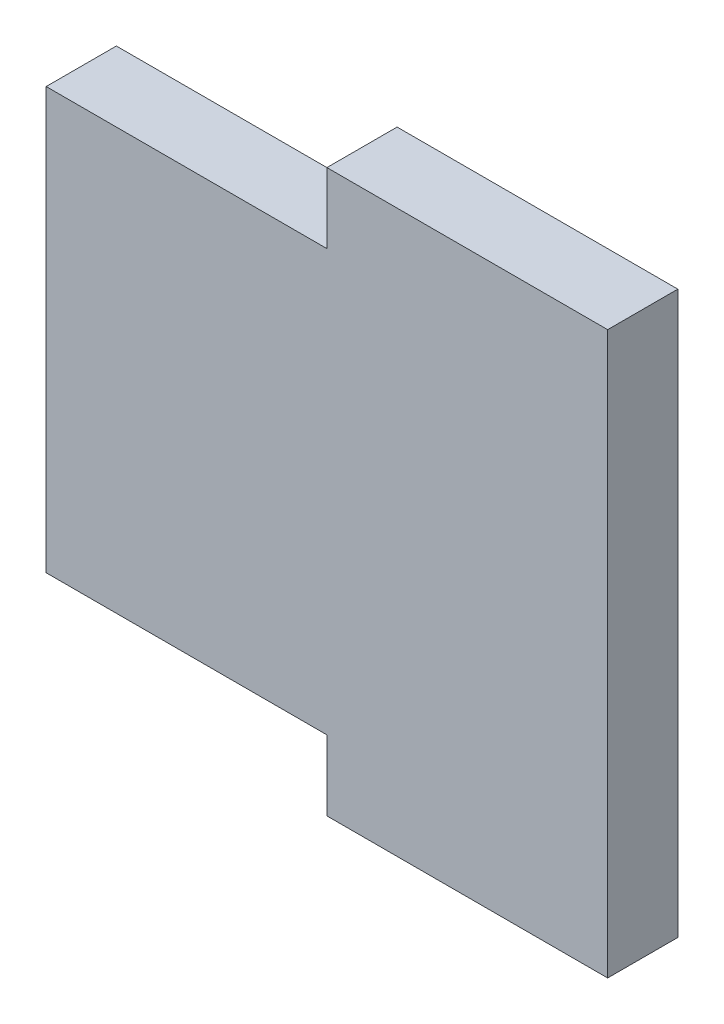
ISO-10303-21;
HEADER;
FILE_DESCRIPTION(('STEP AP214'),'2;1');
FILE_NAME('part.step','',(''),(''),'','','');
FILE_SCHEMA(('AUTOMOTIVE_DESIGN { 1 0 10303 214 1 1 1 1 }'));
ENDSEC;
DATA;
#1=APPLICATION_CONTEXT('core data for automotive mechanical design processes');
#2=APPLICATION_PROTOCOL_DEFINITION('international standard','automotive_design',2000,#1);
#3=PRODUCT_CONTEXT('',#1,'mechanical');
#4=PRODUCT('Part','Part','',(#3));
#5=PRODUCT_RELATED_PRODUCT_CATEGORY('part','',(#4));
#6=PRODUCT_DEFINITION_FORMATION('','',#4);
#7=PRODUCT_DEFINITION_CONTEXT('part definition',#1,'design');
#8=PRODUCT_DEFINITION('design','',#6,#7);
#9=PRODUCT_DEFINITION_SHAPE('','',#8);
#10=(LENGTH_UNIT() NAMED_UNIT(*) SI_UNIT(.MILLI.,.METRE.));
#11=(NAMED_UNIT(*) PLANE_ANGLE_UNIT() SI_UNIT($,.RADIAN.));
#12=(NAMED_UNIT(*) SI_UNIT($,.STERADIAN.) SOLID_ANGLE_UNIT());
#13=UNCERTAINTY_MEASURE_WITH_UNIT(LENGTH_MEASURE(1.E-05),#10,'distance_accuracy_value','');
#14=(GEOMETRIC_REPRESENTATION_CONTEXT(3) GLOBAL_UNCERTAINTY_ASSIGNED_CONTEXT((#13)) GLOBAL_UNIT_ASSIGNED_CONTEXT((#10,
#11,#12)) REPRESENTATION_CONTEXT('',''));
#15=CARTESIAN_POINT('',(0.,0.,0.));
#16=DIRECTION('',(0.,0.,1.));
#17=DIRECTION('',(1.,0.,0.));
#18=AXIS2_PLACEMENT_3D('',#15,#16,#17);
#19=CARTESIAN_POINT('',(250.600505145563,0.,3.175));
#20=DIRECTION('',(0.,-1.,0.));
#21=DIRECTION('',(0.,0.,-1.));
#22=AXIS2_PLACEMENT_3D('',#19,#20,#21);
#23=PLANE('',#22);
#24=DIRECTION('',(-1.,0.,0.));
#25=VECTOR('',#24,1.);
#26=CARTESIAN_POINT('',(250.600505145563,0.,0.));
#27=LINE('',#26,#25);
#28=CARTESIAN_POINT('',(250.600505145563,0.,0.));
#29=VERTEX_POINT('',#28);
#30=CARTESIAN_POINT('',(237.900505145563,0.,0.));
#31=VERTEX_POINT('',#30);
#32=EDGE_CURVE('E129',#29,#31,#27,.T.);
#33=ORIENTED_EDGE('',*,*,#32,.T.);
#34=DIRECTION('',(0.,0.,-1.));
#35=VECTOR('',#34,1.);
#36=CARTESIAN_POINT('',(237.900505145563,0.,3.175));
#37=LINE('',#36,#35);
#38=CARTESIAN_POINT('',(237.900505145563,0.,3.175));
#39=VERTEX_POINT('',#38);
#40=EDGE_CURVE('E11',#39,#31,#37,.T.);
#41=ORIENTED_EDGE('',*,*,#40,.F.);
#42=DIRECTION('',(-1.,0.,0.));
#43=VECTOR('',#42,1.);
#44=CARTESIAN_POINT('',(250.600505145563,0.,3.175));
#45=LINE('',#44,#43);
#46=CARTESIAN_POINT('',(250.600505145563,0.,3.175));
#47=VERTEX_POINT('',#46);
#48=EDGE_CURVE('E148',#47,#39,#45,.T.);
#49=ORIENTED_EDGE('',*,*,#48,.F.);
#50=DIRECTION('',(0.,0.,-1.));
#51=VECTOR('',#50,1.);
#52=CARTESIAN_POINT('',(250.600505145563,0.,3.175));
#53=LINE('',#52,#51);
#54=EDGE_CURVE('E49',#47,#29,#53,.T.);
#55=ORIENTED_EDGE('',*,*,#54,.T.);
#56=EDGE_LOOP('',(#33,#41,#49,#55));
#57=FACE_BOUND('',#56,.T.);
#58=ADVANCED_FACE('F33',(#57),#23,.F.);
#59=CARTESIAN_POINT('',(237.900505145563,0.,3.175));
#60=DIRECTION('',(1.,0.,0.));
#61=DIRECTION('',(0.,0.,-1.));
#62=AXIS2_PLACEMENT_3D('',#59,#60,#61);
#63=PLANE('',#62);
#64=DIRECTION('',(0.,-1.,0.));
#65=VECTOR('',#64,1.);
#66=CARTESIAN_POINT('',(237.900505145563,0.,0.));
#67=LINE('',#66,#65);
#68=CARTESIAN_POINT('',(237.900505145563,-3.175,0.));
#69=VERTEX_POINT('',#68);
#70=EDGE_CURVE('E131',#31,#69,#67,.T.);
#71=ORIENTED_EDGE('',*,*,#70,.T.);
#72=DIRECTION('',(0.,0.,-1.));
#73=VECTOR('',#72,1.);
#74=CARTESIAN_POINT('',(237.900505145563,-3.175,3.175));
#75=LINE('',#74,#73);
#76=CARTESIAN_POINT('',(237.900505145563,-3.175,3.175));
#77=VERTEX_POINT('',#76);
#78=EDGE_CURVE('E41',#77,#69,#75,.T.);
#79=ORIENTED_EDGE('',*,*,#78,.F.);
#80=DIRECTION('',(0.,-1.,0.));
#81=VECTOR('',#80,1.);
#82=CARTESIAN_POINT('',(237.900505145563,0.,3.175));
#83=LINE('',#82,#81);
#84=EDGE_CURVE('E87',#39,#77,#83,.T.);
#85=ORIENTED_EDGE('',*,*,#84,.F.);
#86=ORIENTED_EDGE('',*,*,#40,.T.);
#87=EDGE_LOOP('',(#71,#79,#85,#86));
#88=FACE_BOUND('',#87,.T.);
#89=ADVANCED_FACE('F162',(#88),#63,.F.);
#90=CARTESIAN_POINT('',(225.200505145563,-3.175,3.175));
#91=DIRECTION('',(0.,1.,0.));
#92=DIRECTION('',(0.,0.,1.));
#93=AXIS2_PLACEMENT_3D('',#90,#91,#92);
#94=PLANE('',#93);
#95=DIRECTION('',(1.,0.,0.));
#96=VECTOR('',#95,1.);
#97=CARTESIAN_POINT('',(225.200505145563,-3.175,0.));
#98=LINE('',#97,#96);
#99=CARTESIAN_POINT('',(225.200505145563,-3.175,0.));
#100=VERTEX_POINT('',#99);
#101=EDGE_CURVE('E134',#100,#69,#98,.T.);
#102=ORIENTED_EDGE('',*,*,#101,.F.);
#103=DIRECTION('',(0.,0.,-1.));
#104=VECTOR('',#103,1.);
#105=CARTESIAN_POINT('',(225.200505145563,-3.175,3.175));
#106=LINE('',#105,#104);
#107=CARTESIAN_POINT('',(225.200505145563,-3.175,3.175));
#108=VERTEX_POINT('',#107);
#109=EDGE_CURVE('E155',#108,#100,#106,.T.);
#110=ORIENTED_EDGE('',*,*,#109,.F.);
#111=DIRECTION('',(1.,0.,0.));
#112=VECTOR('',#111,1.);
#113=CARTESIAN_POINT('',(225.200505145563,-3.175,3.175));
#114=LINE('',#113,#112);
#115=EDGE_CURVE('E161',#108,#77,#114,.T.);
#116=ORIENTED_EDGE('',*,*,#115,.T.);
#117=ORIENTED_EDGE('',*,*,#78,.T.);
#118=EDGE_LOOP('',(#102,#110,#116,#117));
#119=FACE_BOUND('',#118,.T.);
#120=ADVANCED_FACE('F159',(#119),#94,.T.);
#121=CARTESIAN_POINT('',(225.200505145563,-3.175,3.175));
#122=DIRECTION('',(1.,0.,0.));
#123=DIRECTION('',(0.,0.,-1.));
#124=AXIS2_PLACEMENT_3D('',#121,#122,#123);
#125=PLANE('',#124);
#126=DIRECTION('',(0.,-1.,0.));
#127=VECTOR('',#126,1.);
#128=CARTESIAN_POINT('',(225.200505145563,-3.175,0.));
#129=LINE('',#128,#127);
#130=CARTESIAN_POINT('',(225.200505145563,-22.225,0.));
#131=VERTEX_POINT('',#130);
#132=EDGE_CURVE('E137',#100,#131,#129,.T.);
#133=ORIENTED_EDGE('',*,*,#132,.T.);
#134=DIRECTION('',(0.,0.,-1.));
#135=VECTOR('',#134,1.);
#136=CARTESIAN_POINT('',(225.200505145563,-22.225,3.175));
#137=LINE('',#136,#135);
#138=CARTESIAN_POINT('',(225.200505145563,-22.225,3.175));
#139=VERTEX_POINT('',#138);
#140=EDGE_CURVE('E152',#139,#131,#137,.T.);
#141=ORIENTED_EDGE('',*,*,#140,.F.);
#142=DIRECTION('',(0.,-1.,0.));
#143=VECTOR('',#142,1.);
#144=CARTESIAN_POINT('',(225.200505145563,-3.175,3.175));
#145=LINE('',#144,#143);
#146=EDGE_CURVE('E174',#108,#139,#145,.T.);
#147=ORIENTED_EDGE('',*,*,#146,.F.);
#148=ORIENTED_EDGE('',*,*,#109,.T.);
#149=EDGE_LOOP('',(#133,#141,#147,#148));
#150=FACE_BOUND('',#149,.T.);
#151=ADVANCED_FACE('F170',(#150),#125,.F.);
#152=CARTESIAN_POINT('',(225.200505145563,-22.225,3.175));
#153=DIRECTION('',(0.,1.,0.));
#154=DIRECTION('',(0.,0.,1.));
#155=AXIS2_PLACEMENT_3D('',#152,#153,#154);
#156=PLANE('',#155);
#157=DIRECTION('',(1.,0.,0.));
#158=VECTOR('',#157,1.);
#159=CARTESIAN_POINT('',(225.200505145563,-22.225,0.));
#160=LINE('',#159,#158);
#161=CARTESIAN_POINT('',(237.900505145563,-22.225,0.));
#162=VERTEX_POINT('',#161);
#163=EDGE_CURVE('E139',#131,#162,#160,.T.);
#164=ORIENTED_EDGE('',*,*,#163,.T.);
#165=DIRECTION('',(0.,0.,-1.));
#166=VECTOR('',#165,1.);
#167=CARTESIAN_POINT('',(237.900505145563,-22.225,3.175));
#168=LINE('',#167,#166);
#169=CARTESIAN_POINT('',(237.900505145563,-22.225,3.175));
#170=VERTEX_POINT('',#169);
#171=EDGE_CURVE('E112',#170,#162,#168,.T.);
#172=ORIENTED_EDGE('',*,*,#171,.F.);
#173=DIRECTION('',(1.,0.,0.));
#174=VECTOR('',#173,1.);
#175=CARTESIAN_POINT('',(225.200505145563,-22.225,3.175));
#176=LINE('',#175,#174);
#177=EDGE_CURVE('E120',#139,#170,#176,.T.);
#178=ORIENTED_EDGE('',*,*,#177,.F.);
#179=ORIENTED_EDGE('',*,*,#140,.T.);
#180=EDGE_LOOP('',(#164,#172,#178,#179));
#181=FACE_BOUND('',#180,.T.);
#182=ADVANCED_FACE('F173',(#181),#156,.F.);
#183=CARTESIAN_POINT('',(237.900505145563,-25.4,3.175));
#184=DIRECTION('',(-1.,0.,0.));
#185=DIRECTION('',(0.,0.,1.));
#186=AXIS2_PLACEMENT_3D('',#183,#184,#185);
#187=PLANE('',#186);
#188=DIRECTION('',(0.,1.,0.));
#189=VECTOR('',#188,1.);
#190=CARTESIAN_POINT('',(237.900505145563,-25.4,0.));
#191=LINE('',#190,#189);
#192=CARTESIAN_POINT('',(237.900505145563,-25.4,0.));
#193=VERTEX_POINT('',#192);
#194=EDGE_CURVE('E108',#193,#162,#191,.T.);
#195=ORIENTED_EDGE('',*,*,#194,.F.);
#196=DIRECTION('',(0.,0.,-1.));
#197=VECTOR('',#196,1.);
#198=CARTESIAN_POINT('',(237.900505145563,-25.4,3.175));
#199=LINE('',#198,#197);
#200=CARTESIAN_POINT('',(237.900505145563,-25.4,3.175));
#201=VERTEX_POINT('',#200);
#202=EDGE_CURVE('E103',#201,#193,#199,.T.);
#203=ORIENTED_EDGE('',*,*,#202,.F.);
#204=DIRECTION('',(0.,1.,0.));
#205=VECTOR('',#204,1.);
#206=CARTESIAN_POINT('',(237.900505145563,-25.4,3.175));
#207=LINE('',#206,#205);
#208=EDGE_CURVE('E106',#201,#170,#207,.T.);
#209=ORIENTED_EDGE('',*,*,#208,.T.);
#210=ORIENTED_EDGE('',*,*,#171,.T.);
#211=EDGE_LOOP('',(#195,#203,#209,#210));
#212=FACE_BOUND('',#211,.T.);
#213=ADVANCED_FACE('F105',(#212),#187,.T.);
#214=CARTESIAN_POINT('',(250.600505145563,-25.4,3.175));
#215=DIRECTION('',(0.,-1.,0.));
#216=DIRECTION('',(0.,0.,-1.));
#217=AXIS2_PLACEMENT_3D('',#214,#215,#216);
#218=PLANE('',#217);
#219=DIRECTION('',(-1.,0.,0.));
#220=VECTOR('',#219,1.);
#221=CARTESIAN_POINT('',(250.600505145563,-25.4,0.));
#222=LINE('',#221,#220);
#223=CARTESIAN_POINT('',(250.600505145563,-25.4,0.));
#224=VERTEX_POINT('',#223);
#225=EDGE_CURVE('E143',#224,#193,#222,.T.);
#226=ORIENTED_EDGE('',*,*,#225,.F.);
#227=DIRECTION('',(0.,0.,-1.));
#228=VECTOR('',#227,1.);
#229=CARTESIAN_POINT('',(250.600505145563,-25.4,3.175));
#230=LINE('',#229,#228);
#231=CARTESIAN_POINT('',(250.600505145563,-25.4,3.175));
#232=VERTEX_POINT('',#231);
#233=EDGE_CURVE('E75',#232,#224,#230,.T.);
#234=ORIENTED_EDGE('',*,*,#233,.F.);
#235=DIRECTION('',(-1.,0.,0.));
#236=VECTOR('',#235,1.);
#237=CARTESIAN_POINT('',(250.600505145563,-25.4,3.175));
#238=LINE('',#237,#236);
#239=EDGE_CURVE('E118',#232,#201,#238,.T.);
#240=ORIENTED_EDGE('',*,*,#239,.T.);
#241=ORIENTED_EDGE('',*,*,#202,.T.);
#242=EDGE_LOOP('',(#226,#234,#240,#241));
#243=FACE_BOUND('',#242,.T.);
#244=ADVANCED_FACE('F123',(#243),#218,.T.);
#245=CARTESIAN_POINT('',(250.600505145563,0.,3.175));
#246=DIRECTION('',(1.,0.,0.));
#247=DIRECTION('',(0.,0.,-1.));
#248=AXIS2_PLACEMENT_3D('',#245,#246,#247);
#249=PLANE('',#248);
#250=DIRECTION('',(0.,-1.,0.));
#251=VECTOR('',#250,1.);
#252=CARTESIAN_POINT('',(250.600505145563,0.,0.));
#253=LINE('',#252,#251);
#254=EDGE_CURVE('E145',#29,#224,#253,.T.);
#255=ORIENTED_EDGE('',*,*,#254,.F.);
#256=ORIENTED_EDGE('',*,*,#54,.F.);
#257=DIRECTION('',(0.,-1.,0.));
#258=VECTOR('',#257,1.);
#259=CARTESIAN_POINT('',(250.600505145563,0.,3.175));
#260=LINE('',#259,#258);
#261=EDGE_CURVE('E124',#47,#232,#260,.T.);
#262=ORIENTED_EDGE('',*,*,#261,.T.);
#263=ORIENTED_EDGE('',*,*,#233,.T.);
#264=EDGE_LOOP('',(#255,#256,#262,#263));
#265=FACE_BOUND('',#264,.T.);
#266=ADVANCED_FACE('F179',(#265),#249,.T.);
#267=CARTESIAN_POINT('',(0.,0.,3.175));
#268=DIRECTION('',(0.,0.,1.));
#269=DIRECTION('',(1.,0.,0.));
#270=AXIS2_PLACEMENT_3D('',#267,#268,#269);
#271=PLANE('',#270);
#272=ORIENTED_EDGE('',*,*,#48,.T.);
#273=ORIENTED_EDGE('',*,*,#84,.T.);
#274=ORIENTED_EDGE('',*,*,#115,.F.);
#275=ORIENTED_EDGE('',*,*,#146,.T.);
#276=ORIENTED_EDGE('',*,*,#177,.T.);
#277=ORIENTED_EDGE('',*,*,#208,.F.);
#278=ORIENTED_EDGE('',*,*,#239,.F.);
#279=ORIENTED_EDGE('',*,*,#261,.F.);
#280=EDGE_LOOP('',(#272,#273,#274,#275,#276,#277,#278,#279));
#281=FACE_BOUND('',#280,.T.);
#282=ADVANCED_FACE('F116',(#281),#271,.T.);
#283=CARTESIAN_POINT('',(0.,0.,0.));
#284=DIRECTION('',(0.,0.,1.));
#285=DIRECTION('',(1.,0.,0.));
#286=AXIS2_PLACEMENT_3D('',#283,#284,#285);
#287=PLANE('',#286);
#288=ORIENTED_EDGE('',*,*,#32,.F.);
#289=ORIENTED_EDGE('',*,*,#254,.T.);
#290=ORIENTED_EDGE('',*,*,#225,.T.);
#291=ORIENTED_EDGE('',*,*,#194,.T.);
#292=ORIENTED_EDGE('',*,*,#163,.F.);
#293=ORIENTED_EDGE('',*,*,#132,.F.);
#294=ORIENTED_EDGE('',*,*,#101,.T.);
#295=ORIENTED_EDGE('',*,*,#70,.F.);
#296=EDGE_LOOP('',(#288,#289,#290,#291,#292,#293,#294,#295));
#297=FACE_BOUND('',#296,.T.);
#298=ADVANCED_FACE('F166',(#297),#287,.F.);
#299=CLOSED_SHELL('',(#58,#89,#120,#151,#182,#213,#244,#266,#282,#298));
#300=MANIFOLD_SOLID_BREP('B2',#299);
#301=ADVANCED_BREP_SHAPE_REPRESENTATION('',(#18,#300),#14);
#302=SHAPE_DEFINITION_REPRESENTATION(#9,#301);
ENDSEC;
END-ISO-10303-21;
